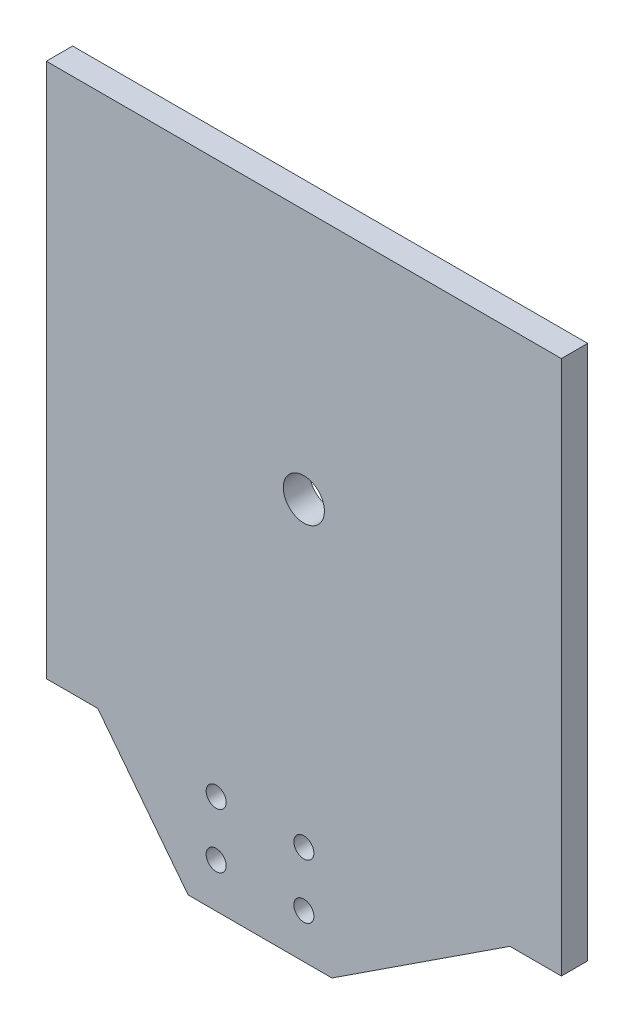
ISO-10303-21;
HEADER;
FILE_DESCRIPTION(('STEP AP214'),'2;1');
FILE_NAME('part.step','',(''),(''),'','','');
FILE_SCHEMA(('AUTOMOTIVE_DESIGN { 1 0 10303 214 1 1 1 1 }'));
ENDSEC;
DATA;
#1=APPLICATION_CONTEXT('core data for automotive mechanical design processes');
#2=APPLICATION_PROTOCOL_DEFINITION('international standard','automotive_design',2000,#1);
#3=PRODUCT_CONTEXT('',#1,'mechanical');
#4=PRODUCT('Part','Part','',(#3));
#5=PRODUCT_RELATED_PRODUCT_CATEGORY('part','',(#4));
#6=PRODUCT_DEFINITION_FORMATION('','',#4);
#7=PRODUCT_DEFINITION_CONTEXT('part definition',#1,'design');
#8=PRODUCT_DEFINITION('design','',#6,#7);
#9=PRODUCT_DEFINITION_SHAPE('','',#8);
#10=(LENGTH_UNIT() NAMED_UNIT(*) SI_UNIT(.MILLI.,.METRE.));
#11=(NAMED_UNIT(*) PLANE_ANGLE_UNIT() SI_UNIT($,.RADIAN.));
#12=(NAMED_UNIT(*) SI_UNIT($,.STERADIAN.) SOLID_ANGLE_UNIT());
#13=UNCERTAINTY_MEASURE_WITH_UNIT(LENGTH_MEASURE(1.E-05),#10,'distance_accuracy_value','');
#14=(GEOMETRIC_REPRESENTATION_CONTEXT(3) GLOBAL_UNCERTAINTY_ASSIGNED_CONTEXT((#13)) GLOBAL_UNIT_ASSIGNED_CONTEXT((#10,
#11,#12)) REPRESENTATION_CONTEXT('',''));
#15=CARTESIAN_POINT('',(0.,0.,0.));
#16=DIRECTION('',(0.,0.,1.));
#17=DIRECTION('',(1.,0.,0.));
#18=AXIS2_PLACEMENT_3D('',#15,#16,#17);
#19=CARTESIAN_POINT('',(0.,0.,6.096));
#20=DIRECTION('',(0.,0.,1.));
#21=DIRECTION('',(1.,0.,0.));
#22=AXIS2_PLACEMENT_3D('',#19,#20,#21);
#23=PLANE('',#22);
#24=CARTESIAN_POINT('',(59.69,-24.4475,6.096));
#25=DIRECTION('',(0.,0.,1.));
#26=DIRECTION('',(1.,0.,0.));
#27=AXIS2_PLACEMENT_3D('',#24,#25,#26);
#28=CIRCLE('',#27,2.3241);
#29=CARTESIAN_POINT('',(57.3659,-24.4475,6.096));
#30=VERTEX_POINT('',#29);
#31=EDGE_CURVE('E199',#30,#30,#28,.T.);
#32=ORIENTED_EDGE('',*,*,#31,.F.);
#33=EDGE_LOOP('',(#32));
#34=FACE_BOUND('',#33,.T.);
#35=CARTESIAN_POINT('',(39.37,-11.7475,6.096));
#36=DIRECTION('',(0.,0.,1.));
#37=DIRECTION('',(1.,0.,0.));
#38=AXIS2_PLACEMENT_3D('',#35,#36,#37);
#39=CIRCLE('',#38,2.3241);
#40=CARTESIAN_POINT('',(37.0459,-11.7475,6.096));
#41=VERTEX_POINT('',#40);
#42=EDGE_CURVE('E187',#41,#41,#39,.T.);
#43=ORIENTED_EDGE('',*,*,#42,.F.);
#44=EDGE_LOOP('',(#43));
#45=FACE_BOUND('',#44,.T.);
#46=DIRECTION('',(0.,-1.,0.));
#47=VECTOR('',#46,1.);
#48=CARTESIAN_POINT('',(0.,0.,6.096));
#49=LINE('',#48,#47);
#50=CARTESIAN_POINT('',(0.,116.205,6.096));
#51=VERTEX_POINT('',#50);
#52=CARTESIAN_POINT('',(0.,-7.747,6.096));
#53=VERTEX_POINT('',#52);
#54=EDGE_CURVE('E52',#51,#53,#49,.T.);
#55=ORIENTED_EDGE('',*,*,#54,.T.);
#56=DIRECTION('',(1.,0.,0.));
#57=VECTOR('',#56,1.);
#58=CARTESIAN_POINT('',(0.,-7.747,6.096));
#59=LINE('',#58,#57);
#60=CARTESIAN_POINT('',(11.938,-7.747,6.096));
#61=VERTEX_POINT('',#60);
#62=EDGE_CURVE('E95',#53,#61,#59,.T.);
#63=ORIENTED_EDGE('',*,*,#62,.T.);
#64=DIRECTION('',(0.612897000765742,-0.790162810091919,0.));
#65=VECTOR('',#64,1.);
#66=CARTESIAN_POINT('',(11.938,-7.747,6.096));
#67=LINE('',#66,#65);
#68=CARTESIAN_POINT('',(32.86125,-34.7218,6.096));
#69=VERTEX_POINT('',#68);
#70=EDGE_CURVE('E164',#61,#69,#67,.T.);
#71=ORIENTED_EDGE('',*,*,#70,.T.);
#72=DIRECTION('',(1.,0.,0.));
#73=VECTOR('',#72,1.);
#74=CARTESIAN_POINT('',(32.86125,-34.7218,6.096));
#75=LINE('',#74,#73);
#76=CARTESIAN_POINT('',(66.19875,-34.7218,6.096));
#77=VERTEX_POINT('',#76);
#78=EDGE_CURVE('E178',#69,#77,#75,.T.);
#79=ORIENTED_EDGE('',*,*,#78,.T.);
#80=DIRECTION('',(0.836894698303908,0.547363922770593,0.));
#81=VECTOR('',#80,1.);
#82=CARTESIAN_POINT('',(66.19875,-34.7218,6.096));
#83=LINE('',#82,#81);
#84=CARTESIAN_POINT('',(107.442,-7.74699999999998,6.096));
#85=VERTEX_POINT('',#84);
#86=EDGE_CURVE('E115',#77,#85,#83,.T.);
#87=ORIENTED_EDGE('',*,*,#86,.T.);
#88=DIRECTION('',(1.,0.,0.));
#89=VECTOR('',#88,1.);
#90=CARTESIAN_POINT('',(107.442,-7.74699999999998,6.096));
#91=LINE('',#90,#89);
#92=CARTESIAN_POINT('',(119.38,-7.74699999999998,6.096));
#93=VERTEX_POINT('',#92);
#94=EDGE_CURVE('E109',#85,#93,#91,.T.);
#95=ORIENTED_EDGE('',*,*,#94,.T.);
#96=DIRECTION('',(0.,1.,0.));
#97=VECTOR('',#96,1.);
#98=CARTESIAN_POINT('',(119.38,-7.74699999999998,6.096));
#99=LINE('',#98,#97);
#100=CARTESIAN_POINT('',(119.38,116.205,6.096));
#101=VERTEX_POINT('',#100);
#102=EDGE_CURVE('E113',#93,#101,#99,.T.);
#103=ORIENTED_EDGE('',*,*,#102,.T.);
#104=DIRECTION('',(-1.,0.,0.));
#105=VECTOR('',#104,1.);
#106=CARTESIAN_POINT('',(0.,116.205,6.096));
#107=LINE('',#106,#105);
#108=EDGE_CURVE('E130',#101,#51,#107,.T.);
#109=ORIENTED_EDGE('',*,*,#108,.T.);
#110=EDGE_LOOP('',(#55,#63,#71,#79,#87,#95,#103,#109));
#111=FACE_BOUND('',#110,.T.);
#112=CARTESIAN_POINT('',(59.69,58.1025,6.096));
#113=DIRECTION('',(0.,0.,1.));
#114=DIRECTION('',(1.,0.,0.));
#115=AXIS2_PLACEMENT_3D('',#112,#113,#114);
#116=CIRCLE('',#115,4.76249999999998);
#117=CARTESIAN_POINT('',(54.9275,58.1025,6.096));
#118=VERTEX_POINT('',#117);
#119=EDGE_CURVE('E139',#118,#118,#116,.T.);
#120=ORIENTED_EDGE('',*,*,#119,.F.);
#121=EDGE_LOOP('',(#120));
#122=FACE_BOUND('',#121,.T.);
#123=CARTESIAN_POINT('',(59.69,-11.7475,6.096));
#124=DIRECTION('',(0.,0.,1.));
#125=DIRECTION('',(1.,0.,0.));
#126=AXIS2_PLACEMENT_3D('',#123,#124,#125);
#127=CIRCLE('',#126,2.3241);
#128=CARTESIAN_POINT('',(57.3659,-11.7475,6.096));
#129=VERTEX_POINT('',#128);
#130=EDGE_CURVE('E193',#129,#129,#127,.T.);
#131=ORIENTED_EDGE('',*,*,#130,.F.);
#132=EDGE_LOOP('',(#131));
#133=FACE_BOUND('',#132,.T.);
#134=CARTESIAN_POINT('',(39.37,-24.4475,6.096));
#135=DIRECTION('',(0.,0.,1.));
#136=DIRECTION('',(1.,0.,0.));
#137=AXIS2_PLACEMENT_3D('',#134,#135,#136);
#138=CIRCLE('',#137,2.3241);
#139=CARTESIAN_POINT('',(37.0459,-24.4475,6.096));
#140=VERTEX_POINT('',#139);
#141=EDGE_CURVE('E205',#140,#140,#138,.T.);
#142=ORIENTED_EDGE('',*,*,#141,.F.);
#143=EDGE_LOOP('',(#142));
#144=FACE_BOUND('',#143,.T.);
#145=ADVANCED_FACE('F35',(#34,#45,#111,#122,#133,#144),#23,.T.);
#146=CARTESIAN_POINT('',(0.,0.,0.));
#147=DIRECTION('',(0.,0.,1.));
#148=DIRECTION('',(1.,0.,0.));
#149=AXIS2_PLACEMENT_3D('',#146,#147,#148);
#150=PLANE('',#149);
#151=CARTESIAN_POINT('',(59.69,-24.4475,0.));
#152=DIRECTION('',(0.,0.,1.));
#153=DIRECTION('',(1.,0.,0.));
#154=AXIS2_PLACEMENT_3D('',#151,#152,#153);
#155=CIRCLE('',#154,2.3241);
#156=CARTESIAN_POINT('',(57.3659,-24.4475,0.));
#157=VERTEX_POINT('',#156);
#158=EDGE_CURVE('E202',#157,#157,#155,.T.);
#159=ORIENTED_EDGE('',*,*,#158,.T.);
#160=EDGE_LOOP('',(#159));
#161=FACE_BOUND('',#160,.T.);
#162=CARTESIAN_POINT('',(39.37,-11.7475,0.));
#163=DIRECTION('',(0.,0.,1.));
#164=DIRECTION('',(1.,0.,0.));
#165=AXIS2_PLACEMENT_3D('',#162,#163,#164);
#166=CIRCLE('',#165,2.3241);
#167=CARTESIAN_POINT('',(37.0459,-11.7475,0.));
#168=VERTEX_POINT('',#167);
#169=EDGE_CURVE('E190',#168,#168,#166,.T.);
#170=ORIENTED_EDGE('',*,*,#169,.T.);
#171=EDGE_LOOP('',(#170));
#172=FACE_BOUND('',#171,.T.);
#173=DIRECTION('',(1.,0.,0.));
#174=VECTOR('',#173,1.);
#175=CARTESIAN_POINT('',(0.,-7.747,0.));
#176=LINE('',#175,#174);
#177=CARTESIAN_POINT('',(0.,-7.747,0.));
#178=VERTEX_POINT('',#177);
#179=CARTESIAN_POINT('',(11.938,-7.747,0.));
#180=VERTEX_POINT('',#179);
#181=EDGE_CURVE('E136',#178,#180,#176,.T.);
#182=ORIENTED_EDGE('',*,*,#181,.F.);
#183=DIRECTION('',(0.,-1.,0.));
#184=VECTOR('',#183,1.);
#185=CARTESIAN_POINT('',(0.,0.,0.));
#186=LINE('',#185,#184);
#187=CARTESIAN_POINT('',(0.,116.205,0.));
#188=VERTEX_POINT('',#187);
#189=EDGE_CURVE('E148',#188,#178,#186,.T.);
#190=ORIENTED_EDGE('',*,*,#189,.F.);
#191=DIRECTION('',(-1.,0.,0.));
#192=VECTOR('',#191,1.);
#193=CARTESIAN_POINT('',(0.,116.205,0.));
#194=LINE('',#193,#192);
#195=CARTESIAN_POINT('',(119.38,116.205,0.));
#196=VERTEX_POINT('',#195);
#197=EDGE_CURVE('E88',#196,#188,#194,.T.);
#198=ORIENTED_EDGE('',*,*,#197,.F.);
#199=DIRECTION('',(0.,1.,0.));
#200=VECTOR('',#199,1.);
#201=CARTESIAN_POINT('',(119.38,0.,0.));
#202=LINE('',#201,#200);
#203=CARTESIAN_POINT('',(119.38,-7.74699999999998,0.));
#204=VERTEX_POINT('',#203);
#205=EDGE_CURVE('E81',#204,#196,#202,.T.);
#206=ORIENTED_EDGE('',*,*,#205,.F.);
#207=DIRECTION('',(1.,0.,0.));
#208=VECTOR('',#207,1.);
#209=CARTESIAN_POINT('',(107.442,-7.74699999999998,0.));
#210=LINE('',#209,#208);
#211=CARTESIAN_POINT('',(107.442,-7.74699999999998,0.));
#212=VERTEX_POINT('',#211);
#213=EDGE_CURVE('E124',#212,#204,#210,.T.);
#214=ORIENTED_EDGE('',*,*,#213,.F.);
#215=DIRECTION('',(0.836894698303908,0.547363922770593,0.));
#216=VECTOR('',#215,1.);
#217=CARTESIAN_POINT('',(66.19875,-34.7218,0.));
#218=LINE('',#217,#216);
#219=CARTESIAN_POINT('',(66.19875,-34.7218,0.));
#220=VERTEX_POINT('',#219);
#221=EDGE_CURVE('E143',#220,#212,#218,.T.);
#222=ORIENTED_EDGE('',*,*,#221,.F.);
#223=DIRECTION('',(1.,0.,0.));
#224=VECTOR('',#223,1.);
#225=CARTESIAN_POINT('',(32.86125,-34.7218,0.));
#226=LINE('',#225,#224);
#227=CARTESIAN_POINT('',(32.86125,-34.7218,0.));
#228=VERTEX_POINT('',#227);
#229=EDGE_CURVE('E141',#228,#220,#226,.T.);
#230=ORIENTED_EDGE('',*,*,#229,.F.);
#231=DIRECTION('',(0.612897000765742,-0.790162810091919,0.));
#232=VECTOR('',#231,1.);
#233=CARTESIAN_POINT('',(11.938,-7.747,0.));
#234=LINE('',#233,#232);
#235=EDGE_CURVE('E138',#180,#228,#234,.T.);
#236=ORIENTED_EDGE('',*,*,#235,.F.);
#237=EDGE_LOOP('',(#182,#190,#198,#206,#214,#222,#230,#236));
#238=FACE_BOUND('',#237,.T.);
#239=CARTESIAN_POINT('',(59.69,58.1025,0.));
#240=DIRECTION('',(0.,0.,1.));
#241=DIRECTION('',(1.,0.,0.));
#242=AXIS2_PLACEMENT_3D('',#239,#240,#241);
#243=CIRCLE('',#242,4.76249999999998);
#244=CARTESIAN_POINT('',(54.9275,58.1025,0.));
#245=VERTEX_POINT('',#244);
#246=EDGE_CURVE('E184',#245,#245,#243,.T.);
#247=ORIENTED_EDGE('',*,*,#246,.T.);
#248=EDGE_LOOP('',(#247));
#249=FACE_BOUND('',#248,.T.);
#250=CARTESIAN_POINT('',(59.69,-11.7475,0.));
#251=DIRECTION('',(0.,0.,1.));
#252=DIRECTION('',(1.,0.,0.));
#253=AXIS2_PLACEMENT_3D('',#250,#251,#252);
#254=CIRCLE('',#253,2.3241);
#255=CARTESIAN_POINT('',(57.3659,-11.7475,0.));
#256=VERTEX_POINT('',#255);
#257=EDGE_CURVE('E196',#256,#256,#254,.T.);
#258=ORIENTED_EDGE('',*,*,#257,.T.);
#259=EDGE_LOOP('',(#258));
#260=FACE_BOUND('',#259,.T.);
#261=CARTESIAN_POINT('',(39.37,-24.4475,0.));
#262=DIRECTION('',(0.,0.,1.));
#263=DIRECTION('',(1.,0.,0.));
#264=AXIS2_PLACEMENT_3D('',#261,#262,#263);
#265=CIRCLE('',#264,2.3241);
#266=CARTESIAN_POINT('',(37.0459,-24.4475,0.));
#267=VERTEX_POINT('',#266);
#268=EDGE_CURVE('E208',#267,#267,#265,.T.);
#269=ORIENTED_EDGE('',*,*,#268,.T.);
#270=EDGE_LOOP('',(#269));
#271=FACE_BOUND('',#270,.T.);
#272=ADVANCED_FACE('F168',(#161,#172,#238,#249,#260,#271),#150,.F.);
#273=CARTESIAN_POINT('',(0.,-7.747,6.096));
#274=DIRECTION('',(0.,1.,0.));
#275=DIRECTION('',(0.,0.,1.));
#276=AXIS2_PLACEMENT_3D('',#273,#274,#275);
#277=PLANE('',#276);
#278=ORIENTED_EDGE('',*,*,#181,.T.);
#279=DIRECTION('',(0.,0.,-1.));
#280=VECTOR('',#279,1.);
#281=CARTESIAN_POINT('',(11.938,-7.747,6.096));
#282=LINE('',#281,#280);
#283=EDGE_CURVE('E44',#61,#180,#282,.T.);
#284=ORIENTED_EDGE('',*,*,#283,.F.);
#285=ORIENTED_EDGE('',*,*,#62,.F.);
#286=DIRECTION('',(0.,0.,-1.));
#287=VECTOR('',#286,1.);
#288=CARTESIAN_POINT('',(0.,-7.747,6.096));
#289=LINE('',#288,#287);
#290=EDGE_CURVE('E11',#53,#178,#289,.T.);
#291=ORIENTED_EDGE('',*,*,#290,.T.);
#292=EDGE_LOOP('',(#278,#284,#285,#291));
#293=FACE_BOUND('',#292,.T.);
#294=ADVANCED_FACE('F37',(#293),#277,.F.);
#295=CARTESIAN_POINT('',(11.938,-7.747,6.096));
#296=DIRECTION('',(0.790162810091919,0.612897000765742,0.));
#297=DIRECTION('',(-0.612897000765742,0.790162810091919,0.));
#298=AXIS2_PLACEMENT_3D('',#295,#296,#297);
#299=PLANE('',#298);
#300=ORIENTED_EDGE('',*,*,#235,.T.);
#301=DIRECTION('',(0.,0.,-1.));
#302=VECTOR('',#301,1.);
#303=CARTESIAN_POINT('',(32.86125,-34.7218,6.096));
#304=LINE('',#303,#302);
#305=EDGE_CURVE('E156',#69,#228,#304,.T.);
#306=ORIENTED_EDGE('',*,*,#305,.F.);
#307=ORIENTED_EDGE('',*,*,#70,.F.);
#308=ORIENTED_EDGE('',*,*,#283,.T.);
#309=EDGE_LOOP('',(#300,#306,#307,#308));
#310=FACE_BOUND('',#309,.T.);
#311=ADVANCED_FACE('F162',(#310),#299,.F.);
#312=CARTESIAN_POINT('',(32.86125,-34.7218,6.096));
#313=DIRECTION('',(0.,1.,0.));
#314=DIRECTION('',(-1.,0.,0.));
#315=AXIS2_PLACEMENT_3D('',#312,#313,#314);
#316=PLANE('',#315);
#317=ORIENTED_EDGE('',*,*,#229,.T.);
#318=DIRECTION('',(0.,0.,-1.));
#319=VECTOR('',#318,1.);
#320=CARTESIAN_POINT('',(66.19875,-34.7218,6.096));
#321=LINE('',#320,#319);
#322=EDGE_CURVE('E153',#77,#220,#321,.T.);
#323=ORIENTED_EDGE('',*,*,#322,.F.);
#324=ORIENTED_EDGE('',*,*,#78,.F.);
#325=ORIENTED_EDGE('',*,*,#305,.T.);
#326=EDGE_LOOP('',(#317,#323,#324,#325));
#327=FACE_BOUND('',#326,.T.);
#328=ADVANCED_FACE('F174',(#327),#316,.F.);
#329=CARTESIAN_POINT('',(66.19875,-34.7218,6.096));
#330=DIRECTION('',(-0.547363922770593,0.836894698303908,0.));
#331=DIRECTION('',(-0.836894698303908,-0.547363922770593,0.));
#332=AXIS2_PLACEMENT_3D('',#329,#330,#331);
#333=PLANE('',#332);
#334=ORIENTED_EDGE('',*,*,#221,.T.);
#335=DIRECTION('',(0.,0.,-1.));
#336=VECTOR('',#335,1.);
#337=CARTESIAN_POINT('',(107.442,-7.74699999999998,6.096));
#338=LINE('',#337,#336);
#339=EDGE_CURVE('E125',#85,#212,#338,.T.);
#340=ORIENTED_EDGE('',*,*,#339,.F.);
#341=ORIENTED_EDGE('',*,*,#86,.F.);
#342=ORIENTED_EDGE('',*,*,#322,.T.);
#343=EDGE_LOOP('',(#334,#340,#341,#342));
#344=FACE_BOUND('',#343,.T.);
#345=ADVANCED_FACE('F177',(#344),#333,.F.);
#346=CARTESIAN_POINT('',(107.442,-7.74699999999998,6.096));
#347=DIRECTION('',(0.,1.,0.));
#348=DIRECTION('',(-1.,0.,0.));
#349=AXIS2_PLACEMENT_3D('',#346,#347,#348);
#350=PLANE('',#349);
#351=ORIENTED_EDGE('',*,*,#213,.T.);
#352=DIRECTION('',(0.,0.,-1.));
#353=VECTOR('',#352,1.);
#354=CARTESIAN_POINT('',(119.38,-7.74699999999998,6.096));
#355=LINE('',#354,#353);
#356=EDGE_CURVE('E121',#93,#204,#355,.T.);
#357=ORIENTED_EDGE('',*,*,#356,.F.);
#358=ORIENTED_EDGE('',*,*,#94,.F.);
#359=ORIENTED_EDGE('',*,*,#339,.T.);
#360=EDGE_LOOP('',(#351,#357,#358,#359));
#361=FACE_BOUND('',#360,.T.);
#362=ADVANCED_FACE('F122',(#361),#350,.F.);
#363=CARTESIAN_POINT('',(119.38,0.,6.096));
#364=DIRECTION('',(-1.,0.,0.));
#365=DIRECTION('',(0.,0.,1.));
#366=AXIS2_PLACEMENT_3D('',#363,#364,#365);
#367=PLANE('',#366);
#368=ORIENTED_EDGE('',*,*,#205,.T.);
#369=DIRECTION('',(0.,0.,-1.));
#370=VECTOR('',#369,1.);
#371=CARTESIAN_POINT('',(119.38,116.205,6.096));
#372=LINE('',#371,#370);
#373=EDGE_CURVE('E126',#101,#196,#372,.T.);
#374=ORIENTED_EDGE('',*,*,#373,.F.);
#375=ORIENTED_EDGE('',*,*,#102,.F.);
#376=ORIENTED_EDGE('',*,*,#356,.T.);
#377=EDGE_LOOP('',(#368,#374,#375,#376));
#378=FACE_BOUND('',#377,.T.);
#379=ADVANCED_FACE('F128',(#378),#367,.F.);
#380=CARTESIAN_POINT('',(0.,116.205,6.096));
#381=DIRECTION('',(0.,-1.,0.));
#382=DIRECTION('',(1.,0.,0.));
#383=AXIS2_PLACEMENT_3D('',#380,#381,#382);
#384=PLANE('',#383);
#385=ORIENTED_EDGE('',*,*,#197,.T.);
#386=DIRECTION('',(0.,0.,-1.));
#387=VECTOR('',#386,1.);
#388=CARTESIAN_POINT('',(0.,116.205,6.096));
#389=LINE('',#388,#387);
#390=EDGE_CURVE('E132',#51,#188,#389,.T.);
#391=ORIENTED_EDGE('',*,*,#390,.F.);
#392=ORIENTED_EDGE('',*,*,#108,.F.);
#393=ORIENTED_EDGE('',*,*,#373,.T.);
#394=EDGE_LOOP('',(#385,#391,#392,#393));
#395=FACE_BOUND('',#394,.T.);
#396=ADVANCED_FACE('F234',(#395),#384,.F.);
#397=CARTESIAN_POINT('',(0.,0.,6.096));
#398=DIRECTION('',(1.,0.,0.));
#399=DIRECTION('',(0.,1.,0.));
#400=AXIS2_PLACEMENT_3D('',#397,#398,#399);
#401=PLANE('',#400);
#402=ORIENTED_EDGE('',*,*,#189,.T.);
#403=ORIENTED_EDGE('',*,*,#290,.F.);
#404=ORIENTED_EDGE('',*,*,#54,.F.);
#405=ORIENTED_EDGE('',*,*,#390,.T.);
#406=EDGE_LOOP('',(#402,#403,#404,#405));
#407=FACE_BOUND('',#406,.T.);
#408=ADVANCED_FACE('F231',(#407),#401,.F.);
#409=CARTESIAN_POINT('',(59.69,58.1025,6.096));
#410=DIRECTION('',(0.,0.,-1.));
#411=DIRECTION('',(-1.,0.,0.));
#412=AXIS2_PLACEMENT_3D('',#409,#410,#411);
#413=CYLINDRICAL_SURFACE('',#412,4.76249999999998);
#414=CARTESIAN_POINT('',(54.9275,58.1025,6.096));
#415=CARTESIAN_POINT('',(54.9275,58.1025,6.0325));
#416=CARTESIAN_POINT('',(54.9275,58.1025,5.969));
#417=CARTESIAN_POINT('',(54.9275,58.1025,5.842));
#418=CARTESIAN_POINT('',(54.9275,58.1025,5.7785));
#419=CARTESIAN_POINT('',(54.9275,58.1025,5.6515));
#420=CARTESIAN_POINT('',(54.9275,58.1025,5.588));
#421=CARTESIAN_POINT('',(54.9275,58.1025,5.461));
#422=CARTESIAN_POINT('',(54.9275,58.1025,5.3975));
#423=CARTESIAN_POINT('',(54.9275,58.1025,5.2705));
#424=CARTESIAN_POINT('',(54.9275,58.1025,5.207));
#425=CARTESIAN_POINT('',(54.9275,58.1025,5.08));
#426=CARTESIAN_POINT('',(54.9275,58.1025,5.0165));
#427=CARTESIAN_POINT('',(54.9275,58.1025,4.8895));
#428=CARTESIAN_POINT('',(54.9275,58.1025,4.826));
#429=CARTESIAN_POINT('',(54.9275,58.1025,4.699));
#430=CARTESIAN_POINT('',(54.9275,58.1025,4.6355));
#431=CARTESIAN_POINT('',(54.9275,58.1025,4.5085));
#432=CARTESIAN_POINT('',(54.9275,58.1025,4.445));
#433=CARTESIAN_POINT('',(54.9275,58.1025,4.318));
#434=CARTESIAN_POINT('',(54.9275,58.1025,4.2545));
#435=CARTESIAN_POINT('',(54.9275,58.1025,4.1275));
#436=CARTESIAN_POINT('',(54.9275,58.1025,4.064));
#437=CARTESIAN_POINT('',(54.9275,58.1025,3.937));
#438=CARTESIAN_POINT('',(54.9275,58.1025,3.8735));
#439=CARTESIAN_POINT('',(54.9275,58.1025,3.7465));
#440=CARTESIAN_POINT('',(54.9275,58.1025,3.683));
#441=CARTESIAN_POINT('',(54.9275,58.1025,3.556));
#442=CARTESIAN_POINT('',(54.9275,58.1025,3.4925));
#443=CARTESIAN_POINT('',(54.9275,58.1025,3.3655));
#444=CARTESIAN_POINT('',(54.9275,58.1025,3.302));
#445=CARTESIAN_POINT('',(54.9275,58.1025,3.175));
#446=CARTESIAN_POINT('',(54.9275,58.1025,3.1115));
#447=CARTESIAN_POINT('',(54.9275,58.1025,2.9845));
#448=CARTESIAN_POINT('',(54.9275,58.1025,2.921));
#449=CARTESIAN_POINT('',(54.9275,58.1025,2.794));
#450=CARTESIAN_POINT('',(54.9275,58.1025,2.7305));
#451=CARTESIAN_POINT('',(54.9275,58.1025,2.6035));
#452=CARTESIAN_POINT('',(54.9275,58.1025,2.54));
#453=CARTESIAN_POINT('',(54.9275,58.1025,2.413));
#454=CARTESIAN_POINT('',(54.9275,58.1025,2.3495));
#455=CARTESIAN_POINT('',(54.9275,58.1025,2.2225));
#456=CARTESIAN_POINT('',(54.9275,58.1025,2.159));
#457=CARTESIAN_POINT('',(54.9275,58.1025,2.032));
#458=CARTESIAN_POINT('',(54.9275,58.1025,1.9685));
#459=CARTESIAN_POINT('',(54.9275,58.1025,1.8415));
#460=CARTESIAN_POINT('',(54.9275,58.1025,1.778));
#461=CARTESIAN_POINT('',(54.9275,58.1025,1.651));
#462=CARTESIAN_POINT('',(54.9275,58.1025,1.5875));
#463=CARTESIAN_POINT('',(54.9275,58.1025,1.4605));
#464=CARTESIAN_POINT('',(54.9275,58.1025,1.397));
#465=CARTESIAN_POINT('',(54.9275,58.1025,1.27));
#466=CARTESIAN_POINT('',(54.9275,58.1025,1.2065));
#467=CARTESIAN_POINT('',(54.9275,58.1025,1.0795));
#468=CARTESIAN_POINT('',(54.9275,58.1025,1.016));
#469=CARTESIAN_POINT('',(54.9275,58.1025,0.889));
#470=CARTESIAN_POINT('',(54.9275,58.1025,0.8255));
#471=CARTESIAN_POINT('',(54.9275,58.1025,0.6985));
#472=CARTESIAN_POINT('',(54.9275,58.1025,0.635));
#473=CARTESIAN_POINT('',(54.9275,58.1025,0.508));
#474=CARTESIAN_POINT('',(54.9275,58.1025,0.4445));
#475=CARTESIAN_POINT('',(54.9275,58.1025,0.3175));
#476=CARTESIAN_POINT('',(54.9275,58.1025,0.254));
#477=CARTESIAN_POINT('',(54.9275,58.1025,0.127));
#478=CARTESIAN_POINT('',(54.9275,58.1025,0.0634999999999999));
#479=CARTESIAN_POINT('',(54.9275,58.1025,0.));
#480=B_SPLINE_CURVE_WITH_KNOTS('',3,(#414,#415,#416,#417,#418,#419,#420,#421,#422,#423,#424,
#425,#426,#427,#428,#429,#430,#431,#432,#433,#434,#435,#436,#437,#438,#439,#440,#441,#442,#443,
#444,#445,#446,#447,#448,#449,#450,#451,#452,#453,#454,#455,#456,#457,#458,#459,#460,#461,#462,
#463,#464,#465,#466,#467,#468,#469,#470,#471,#472,#473,#474,#475,#476,#477,#478,#479),
.UNSPECIFIED.,.F.,.F.,(4,2,2,2,2,2,2,2,2,2,2,2,2,2,2,2,2,2,2,2,2,2,2,2,2,2,2,2,2,2,2,2,4),(0.,
0.190500000000001,0.381,0.5715,0.762000000000001,0.9525,1.143,1.3335,1.524,1.7145,1.905,2.0955,
2.286,2.4765,2.667,2.8575,3.048,3.2385,3.429,3.6195,3.81,4.0005,4.191,4.3815,4.572,4.7625,4.953,
5.1435,5.334,5.5245,5.715,5.9055,6.096),.UNSPECIFIED.);
#481=EDGE_CURVE('BSEAM228',#118,#245,#480,.T.);
#482=ORIENTED_EDGE('',*,*,#119,.T.);
#483=ORIENTED_EDGE('',*,*,#246,.F.);
#484=ORIENTED_EDGE('',*,*,#481,.T.);
#485=ORIENTED_EDGE('',*,*,#481,.F.);
#486=EDGE_LOOP('',(#482,#484,#483,#485));
#487=FACE_BOUND('',#486,.T.);
#488=ADVANCED_FACE('F228',(#487),#413,.F.);
#489=CARTESIAN_POINT('',(39.37,-11.7475,6.096));
#490=DIRECTION('',(0.,0.,-1.));
#491=DIRECTION('',(-1.,0.,0.));
#492=AXIS2_PLACEMENT_3D('',#489,#490,#491);
#493=CYLINDRICAL_SURFACE('',#492,2.3241);
#494=CARTESIAN_POINT('',(37.0459,-11.7475,6.096));
#495=CARTESIAN_POINT('',(37.0459,-11.7475,6.0325));
#496=CARTESIAN_POINT('',(37.0459,-11.7475,5.969));
#497=CARTESIAN_POINT('',(37.0459,-11.7475,5.842));
#498=CARTESIAN_POINT('',(37.0459,-11.7475,5.7785));
#499=CARTESIAN_POINT('',(37.0459,-11.7475,5.6515));
#500=CARTESIAN_POINT('',(37.0459,-11.7475,5.588));
#501=CARTESIAN_POINT('',(37.0459,-11.7475,5.461));
#502=CARTESIAN_POINT('',(37.0459,-11.7475,5.3975));
#503=CARTESIAN_POINT('',(37.0459,-11.7475,5.2705));
#504=CARTESIAN_POINT('',(37.0459,-11.7475,5.207));
#505=CARTESIAN_POINT('',(37.0459,-11.7475,5.08));
#506=CARTESIAN_POINT('',(37.0459,-11.7475,5.0165));
#507=CARTESIAN_POINT('',(37.0459,-11.7475,4.8895));
#508=CARTESIAN_POINT('',(37.0459,-11.7475,4.826));
#509=CARTESIAN_POINT('',(37.0459,-11.7475,4.699));
#510=CARTESIAN_POINT('',(37.0459,-11.7475,4.6355));
#511=CARTESIAN_POINT('',(37.0459,-11.7475,4.5085));
#512=CARTESIAN_POINT('',(37.0459,-11.7475,4.445));
#513=CARTESIAN_POINT('',(37.0459,-11.7475,4.318));
#514=CARTESIAN_POINT('',(37.0459,-11.7475,4.2545));
#515=CARTESIAN_POINT('',(37.0459,-11.7475,4.1275));
#516=CARTESIAN_POINT('',(37.0459,-11.7475,4.064));
#517=CARTESIAN_POINT('',(37.0459,-11.7475,3.937));
#518=CARTESIAN_POINT('',(37.0459,-11.7475,3.8735));
#519=CARTESIAN_POINT('',(37.0459,-11.7475,3.7465));
#520=CARTESIAN_POINT('',(37.0459,-11.7475,3.683));
#521=CARTESIAN_POINT('',(37.0459,-11.7475,3.556));
#522=CARTESIAN_POINT('',(37.0459,-11.7475,3.4925));
#523=CARTESIAN_POINT('',(37.0459,-11.7475,3.3655));
#524=CARTESIAN_POINT('',(37.0459,-11.7475,3.302));
#525=CARTESIAN_POINT('',(37.0459,-11.7475,3.175));
#526=CARTESIAN_POINT('',(37.0459,-11.7475,3.1115));
#527=CARTESIAN_POINT('',(37.0459,-11.7475,2.9845));
#528=CARTESIAN_POINT('',(37.0459,-11.7475,2.921));
#529=CARTESIAN_POINT('',(37.0459,-11.7475,2.794));
#530=CARTESIAN_POINT('',(37.0459,-11.7475,2.7305));
#531=CARTESIAN_POINT('',(37.0459,-11.7475,2.6035));
#532=CARTESIAN_POINT('',(37.0459,-11.7475,2.54));
#533=CARTESIAN_POINT('',(37.0459,-11.7475,2.413));
#534=CARTESIAN_POINT('',(37.0459,-11.7475,2.3495));
#535=CARTESIAN_POINT('',(37.0459,-11.7475,2.2225));
#536=CARTESIAN_POINT('',(37.0459,-11.7475,2.159));
#537=CARTESIAN_POINT('',(37.0459,-11.7475,2.032));
#538=CARTESIAN_POINT('',(37.0459,-11.7475,1.9685));
#539=CARTESIAN_POINT('',(37.0459,-11.7475,1.8415));
#540=CARTESIAN_POINT('',(37.0459,-11.7475,1.778));
#541=CARTESIAN_POINT('',(37.0459,-11.7475,1.651));
#542=CARTESIAN_POINT('',(37.0459,-11.7475,1.5875));
#543=CARTESIAN_POINT('',(37.0459,-11.7475,1.4605));
#544=CARTESIAN_POINT('',(37.0459,-11.7475,1.397));
#545=CARTESIAN_POINT('',(37.0459,-11.7475,1.27));
#546=CARTESIAN_POINT('',(37.0459,-11.7475,1.2065));
#547=CARTESIAN_POINT('',(37.0459,-11.7475,1.0795));
#548=CARTESIAN_POINT('',(37.0459,-11.7475,1.016));
#549=CARTESIAN_POINT('',(37.0459,-11.7475,0.889));
#550=CARTESIAN_POINT('',(37.0459,-11.7475,0.8255));
#551=CARTESIAN_POINT('',(37.0459,-11.7475,0.6985));
#552=CARTESIAN_POINT('',(37.0459,-11.7475,0.635));
#553=CARTESIAN_POINT('',(37.0459,-11.7475,0.508));
#554=CARTESIAN_POINT('',(37.0459,-11.7475,0.4445));
#555=CARTESIAN_POINT('',(37.0459,-11.7475,0.3175));
#556=CARTESIAN_POINT('',(37.0459,-11.7475,0.254));
#557=CARTESIAN_POINT('',(37.0459,-11.7475,0.127));
#558=CARTESIAN_POINT('',(37.0459,-11.7475,0.0634999999999999));
#559=CARTESIAN_POINT('',(37.0459,-11.7475,0.));
#560=B_SPLINE_CURVE_WITH_KNOTS('',3,(#494,#495,#496,#497,#498,#499,#500,#501,#502,#503,#504,
#505,#506,#507,#508,#509,#510,#511,#512,#513,#514,#515,#516,#517,#518,#519,#520,#521,#522,#523,
#524,#525,#526,#527,#528,#529,#530,#531,#532,#533,#534,#535,#536,#537,#538,#539,#540,#541,#542,
#543,#544,#545,#546,#547,#548,#549,#550,#551,#552,#553,#554,#555,#556,#557,#558,#559),
.UNSPECIFIED.,.F.,.F.,(4,2,2,2,2,2,2,2,2,2,2,2,2,2,2,2,2,2,2,2,2,2,2,2,2,2,2,2,2,2,2,2,4),(0.,
0.190500000000001,0.381,0.5715,0.762000000000001,0.9525,1.143,1.3335,1.524,1.7145,1.905,2.0955,
2.286,2.4765,2.667,2.8575,3.048,3.2385,3.429,3.6195,3.81,4.0005,4.191,4.3815,4.572,4.7625,4.953,
5.1435,5.334,5.5245,5.715,5.9055,6.096),.UNSPECIFIED.);
#561=EDGE_CURVE('BSEAM310',#41,#168,#560,.T.);
#562=ORIENTED_EDGE('',*,*,#42,.T.);
#563=ORIENTED_EDGE('',*,*,#169,.F.);
#564=ORIENTED_EDGE('',*,*,#561,.T.);
#565=ORIENTED_EDGE('',*,*,#561,.F.);
#566=EDGE_LOOP('',(#562,#564,#563,#565));
#567=FACE_BOUND('',#566,.T.);
#568=ADVANCED_FACE('F310',(#567),#493,.F.);
#569=CARTESIAN_POINT('',(59.69,-11.7475,6.096));
#570=DIRECTION('',(0.,0.,-1.));
#571=DIRECTION('',(-1.,0.,0.));
#572=AXIS2_PLACEMENT_3D('',#569,#570,#571);
#573=CYLINDRICAL_SURFACE('',#572,2.3241);
#574=CARTESIAN_POINT('',(57.3659,-11.7475,6.096));
#575=CARTESIAN_POINT('',(57.3659,-11.7475,6.0325));
#576=CARTESIAN_POINT('',(57.3659,-11.7475,5.969));
#577=CARTESIAN_POINT('',(57.3659,-11.7475,5.842));
#578=CARTESIAN_POINT('',(57.3659,-11.7475,5.7785));
#579=CARTESIAN_POINT('',(57.3659,-11.7475,5.6515));
#580=CARTESIAN_POINT('',(57.3659,-11.7475,5.588));
#581=CARTESIAN_POINT('',(57.3659,-11.7475,5.461));
#582=CARTESIAN_POINT('',(57.3659,-11.7475,5.3975));
#583=CARTESIAN_POINT('',(57.3659,-11.7475,5.2705));
#584=CARTESIAN_POINT('',(57.3659,-11.7475,5.207));
#585=CARTESIAN_POINT('',(57.3659,-11.7475,5.08));
#586=CARTESIAN_POINT('',(57.3659,-11.7475,5.0165));
#587=CARTESIAN_POINT('',(57.3659,-11.7475,4.8895));
#588=CARTESIAN_POINT('',(57.3659,-11.7475,4.826));
#589=CARTESIAN_POINT('',(57.3659,-11.7475,4.699));
#590=CARTESIAN_POINT('',(57.3659,-11.7475,4.6355));
#591=CARTESIAN_POINT('',(57.3659,-11.7475,4.5085));
#592=CARTESIAN_POINT('',(57.3659,-11.7475,4.445));
#593=CARTESIAN_POINT('',(57.3659,-11.7475,4.318));
#594=CARTESIAN_POINT('',(57.3659,-11.7475,4.2545));
#595=CARTESIAN_POINT('',(57.3659,-11.7475,4.1275));
#596=CARTESIAN_POINT('',(57.3659,-11.7475,4.064));
#597=CARTESIAN_POINT('',(57.3659,-11.7475,3.937));
#598=CARTESIAN_POINT('',(57.3659,-11.7475,3.8735));
#599=CARTESIAN_POINT('',(57.3659,-11.7475,3.7465));
#600=CARTESIAN_POINT('',(57.3659,-11.7475,3.683));
#601=CARTESIAN_POINT('',(57.3659,-11.7475,3.556));
#602=CARTESIAN_POINT('',(57.3659,-11.7475,3.4925));
#603=CARTESIAN_POINT('',(57.3659,-11.7475,3.3655));
#604=CARTESIAN_POINT('',(57.3659,-11.7475,3.302));
#605=CARTESIAN_POINT('',(57.3659,-11.7475,3.175));
#606=CARTESIAN_POINT('',(57.3659,-11.7475,3.1115));
#607=CARTESIAN_POINT('',(57.3659,-11.7475,2.9845));
#608=CARTESIAN_POINT('',(57.3659,-11.7475,2.921));
#609=CARTESIAN_POINT('',(57.3659,-11.7475,2.794));
#610=CARTESIAN_POINT('',(57.3659,-11.7475,2.7305));
#611=CARTESIAN_POINT('',(57.3659,-11.7475,2.6035));
#612=CARTESIAN_POINT('',(57.3659,-11.7475,2.54));
#613=CARTESIAN_POINT('',(57.3659,-11.7475,2.413));
#614=CARTESIAN_POINT('',(57.3659,-11.7475,2.3495));
#615=CARTESIAN_POINT('',(57.3659,-11.7475,2.2225));
#616=CARTESIAN_POINT('',(57.3659,-11.7475,2.159));
#617=CARTESIAN_POINT('',(57.3659,-11.7475,2.032));
#618=CARTESIAN_POINT('',(57.3659,-11.7475,1.9685));
#619=CARTESIAN_POINT('',(57.3659,-11.7475,1.8415));
#620=CARTESIAN_POINT('',(57.3659,-11.7475,1.778));
#621=CARTESIAN_POINT('',(57.3659,-11.7475,1.651));
#622=CARTESIAN_POINT('',(57.3659,-11.7475,1.5875));
#623=CARTESIAN_POINT('',(57.3659,-11.7475,1.4605));
#624=CARTESIAN_POINT('',(57.3659,-11.7475,1.397));
#625=CARTESIAN_POINT('',(57.3659,-11.7475,1.27));
#626=CARTESIAN_POINT('',(57.3659,-11.7475,1.2065));
#627=CARTESIAN_POINT('',(57.3659,-11.7475,1.0795));
#628=CARTESIAN_POINT('',(57.3659,-11.7475,1.016));
#629=CARTESIAN_POINT('',(57.3659,-11.7475,0.889));
#630=CARTESIAN_POINT('',(57.3659,-11.7475,0.8255));
#631=CARTESIAN_POINT('',(57.3659,-11.7475,0.6985));
#632=CARTESIAN_POINT('',(57.3659,-11.7475,0.635));
#633=CARTESIAN_POINT('',(57.3659,-11.7475,0.508));
#634=CARTESIAN_POINT('',(57.3659,-11.7475,0.4445));
#635=CARTESIAN_POINT('',(57.3659,-11.7475,0.3175));
#636=CARTESIAN_POINT('',(57.3659,-11.7475,0.254));
#637=CARTESIAN_POINT('',(57.3659,-11.7475,0.127));
#638=CARTESIAN_POINT('',(57.3659,-11.7475,0.0634999999999999));
#639=CARTESIAN_POINT('',(57.3659,-11.7475,0.));
#640=B_SPLINE_CURVE_WITH_KNOTS('',3,(#574,#575,#576,#577,#578,#579,#580,#581,#582,#583,#584,
#585,#586,#587,#588,#589,#590,#591,#592,#593,#594,#595,#596,#597,#598,#599,#600,#601,#602,#603,
#604,#605,#606,#607,#608,#609,#610,#611,#612,#613,#614,#615,#616,#617,#618,#619,#620,#621,#622,
#623,#624,#625,#626,#627,#628,#629,#630,#631,#632,#633,#634,#635,#636,#637,#638,#639),
.UNSPECIFIED.,.F.,.F.,(4,2,2,2,2,2,2,2,2,2,2,2,2,2,2,2,2,2,2,2,2,2,2,2,2,2,2,2,2,2,2,2,4),(0.,
0.190500000000001,0.381,0.5715,0.762000000000001,0.9525,1.143,1.3335,1.524,1.7145,1.905,2.0955,
2.286,2.4765,2.667,2.8575,3.048,3.2385,3.429,3.6195,3.81,4.0005,4.191,4.3815,4.572,4.7625,4.953,
5.1435,5.334,5.5245,5.715,5.9055,6.096),.UNSPECIFIED.);
#641=EDGE_CURVE('BSEAM318',#129,#256,#640,.T.);
#642=ORIENTED_EDGE('',*,*,#130,.T.);
#643=ORIENTED_EDGE('',*,*,#257,.F.);
#644=ORIENTED_EDGE('',*,*,#641,.T.);
#645=ORIENTED_EDGE('',*,*,#641,.F.);
#646=EDGE_LOOP('',(#642,#644,#643,#645));
#647=FACE_BOUND('',#646,.T.);
#648=ADVANCED_FACE('F318',(#647),#573,.F.);
#649=CARTESIAN_POINT('',(59.69,-24.4475,6.096));
#650=DIRECTION('',(0.,0.,-1.));
#651=DIRECTION('',(-1.,0.,0.));
#652=AXIS2_PLACEMENT_3D('',#649,#650,#651);
#653=CYLINDRICAL_SURFACE('',#652,2.3241);
#654=CARTESIAN_POINT('',(57.3659,-24.4475,6.096));
#655=CARTESIAN_POINT('',(57.3659,-24.4475,6.0325));
#656=CARTESIAN_POINT('',(57.3659,-24.4475,5.969));
#657=CARTESIAN_POINT('',(57.3659,-24.4475,5.842));
#658=CARTESIAN_POINT('',(57.3659,-24.4475,5.7785));
#659=CARTESIAN_POINT('',(57.3659,-24.4475,5.6515));
#660=CARTESIAN_POINT('',(57.3659,-24.4475,5.588));
#661=CARTESIAN_POINT('',(57.3659,-24.4475,5.461));
#662=CARTESIAN_POINT('',(57.3659,-24.4475,5.3975));
#663=CARTESIAN_POINT('',(57.3659,-24.4475,5.2705));
#664=CARTESIAN_POINT('',(57.3659,-24.4475,5.207));
#665=CARTESIAN_POINT('',(57.3659,-24.4475,5.08));
#666=CARTESIAN_POINT('',(57.3659,-24.4475,5.0165));
#667=CARTESIAN_POINT('',(57.3659,-24.4475,4.8895));
#668=CARTESIAN_POINT('',(57.3659,-24.4475,4.826));
#669=CARTESIAN_POINT('',(57.3659,-24.4475,4.699));
#670=CARTESIAN_POINT('',(57.3659,-24.4475,4.6355));
#671=CARTESIAN_POINT('',(57.3659,-24.4475,4.5085));
#672=CARTESIAN_POINT('',(57.3659,-24.4475,4.445));
#673=CARTESIAN_POINT('',(57.3659,-24.4475,4.318));
#674=CARTESIAN_POINT('',(57.3659,-24.4475,4.2545));
#675=CARTESIAN_POINT('',(57.3659,-24.4475,4.1275));
#676=CARTESIAN_POINT('',(57.3659,-24.4475,4.064));
#677=CARTESIAN_POINT('',(57.3659,-24.4475,3.937));
#678=CARTESIAN_POINT('',(57.3659,-24.4475,3.8735));
#679=CARTESIAN_POINT('',(57.3659,-24.4475,3.7465));
#680=CARTESIAN_POINT('',(57.3659,-24.4475,3.683));
#681=CARTESIAN_POINT('',(57.3659,-24.4475,3.556));
#682=CARTESIAN_POINT('',(57.3659,-24.4475,3.4925));
#683=CARTESIAN_POINT('',(57.3659,-24.4475,3.3655));
#684=CARTESIAN_POINT('',(57.3659,-24.4475,3.302));
#685=CARTESIAN_POINT('',(57.3659,-24.4475,3.175));
#686=CARTESIAN_POINT('',(57.3659,-24.4475,3.1115));
#687=CARTESIAN_POINT('',(57.3659,-24.4475,2.9845));
#688=CARTESIAN_POINT('',(57.3659,-24.4475,2.921));
#689=CARTESIAN_POINT('',(57.3659,-24.4475,2.794));
#690=CARTESIAN_POINT('',(57.3659,-24.4475,2.7305));
#691=CARTESIAN_POINT('',(57.3659,-24.4475,2.6035));
#692=CARTESIAN_POINT('',(57.3659,-24.4475,2.54));
#693=CARTESIAN_POINT('',(57.3659,-24.4475,2.413));
#694=CARTESIAN_POINT('',(57.3659,-24.4475,2.3495));
#695=CARTESIAN_POINT('',(57.3659,-24.4475,2.2225));
#696=CARTESIAN_POINT('',(57.3659,-24.4475,2.159));
#697=CARTESIAN_POINT('',(57.3659,-24.4475,2.032));
#698=CARTESIAN_POINT('',(57.3659,-24.4475,1.9685));
#699=CARTESIAN_POINT('',(57.3659,-24.4475,1.8415));
#700=CARTESIAN_POINT('',(57.3659,-24.4475,1.778));
#701=CARTESIAN_POINT('',(57.3659,-24.4475,1.651));
#702=CARTESIAN_POINT('',(57.3659,-24.4475,1.5875));
#703=CARTESIAN_POINT('',(57.3659,-24.4475,1.4605));
#704=CARTESIAN_POINT('',(57.3659,-24.4475,1.397));
#705=CARTESIAN_POINT('',(57.3659,-24.4475,1.27));
#706=CARTESIAN_POINT('',(57.3659,-24.4475,1.2065));
#707=CARTESIAN_POINT('',(57.3659,-24.4475,1.0795));
#708=CARTESIAN_POINT('',(57.3659,-24.4475,1.016));
#709=CARTESIAN_POINT('',(57.3659,-24.4475,0.889));
#710=CARTESIAN_POINT('',(57.3659,-24.4475,0.8255));
#711=CARTESIAN_POINT('',(57.3659,-24.4475,0.6985));
#712=CARTESIAN_POINT('',(57.3659,-24.4475,0.635));
#713=CARTESIAN_POINT('',(57.3659,-24.4475,0.508));
#714=CARTESIAN_POINT('',(57.3659,-24.4475,0.4445));
#715=CARTESIAN_POINT('',(57.3659,-24.4475,0.3175));
#716=CARTESIAN_POINT('',(57.3659,-24.4475,0.254));
#717=CARTESIAN_POINT('',(57.3659,-24.4475,0.127));
#718=CARTESIAN_POINT('',(57.3659,-24.4475,0.0634999999999999));
#719=CARTESIAN_POINT('',(57.3659,-24.4475,0.));
#720=B_SPLINE_CURVE_WITH_KNOTS('',3,(#654,#655,#656,#657,#658,#659,#660,#661,#662,#663,#664,
#665,#666,#667,#668,#669,#670,#671,#672,#673,#674,#675,#676,#677,#678,#679,#680,#681,#682,#683,
#684,#685,#686,#687,#688,#689,#690,#691,#692,#693,#694,#695,#696,#697,#698,#699,#700,#701,#702,
#703,#704,#705,#706,#707,#708,#709,#710,#711,#712,#713,#714,#715,#716,#717,#718,#719),
.UNSPECIFIED.,.F.,.F.,(4,2,2,2,2,2,2,2,2,2,2,2,2,2,2,2,2,2,2,2,2,2,2,2,2,2,2,2,2,2,2,2,4),(0.,
0.190500000000001,0.381,0.5715,0.762000000000001,0.9525,1.143,1.3335,1.524,1.7145,1.905,2.0955,
2.286,2.4765,2.667,2.8575,3.048,3.2385,3.429,3.6195,3.81,4.0005,4.191,4.3815,4.572,4.7625,4.953,
5.1435,5.334,5.5245,5.715,5.9055,6.096),.UNSPECIFIED.);
#721=EDGE_CURVE('BSEAM326',#30,#157,#720,.T.);
#722=ORIENTED_EDGE('',*,*,#31,.T.);
#723=ORIENTED_EDGE('',*,*,#158,.F.);
#724=ORIENTED_EDGE('',*,*,#721,.T.);
#725=ORIENTED_EDGE('',*,*,#721,.F.);
#726=EDGE_LOOP('',(#722,#724,#723,#725));
#727=FACE_BOUND('',#726,.T.);
#728=ADVANCED_FACE('F326',(#727),#653,.F.);
#729=CARTESIAN_POINT('',(39.37,-24.4475,6.096));
#730=DIRECTION('',(0.,0.,-1.));
#731=DIRECTION('',(-1.,0.,0.));
#732=AXIS2_PLACEMENT_3D('',#729,#730,#731);
#733=CYLINDRICAL_SURFACE('',#732,2.3241);
#734=CARTESIAN_POINT('',(37.0459,-24.4475,6.096));
#735=CARTESIAN_POINT('',(37.0459,-24.4475,6.0325));
#736=CARTESIAN_POINT('',(37.0459,-24.4475,5.969));
#737=CARTESIAN_POINT('',(37.0459,-24.4475,5.842));
#738=CARTESIAN_POINT('',(37.0459,-24.4475,5.7785));
#739=CARTESIAN_POINT('',(37.0459,-24.4475,5.6515));
#740=CARTESIAN_POINT('',(37.0459,-24.4475,5.588));
#741=CARTESIAN_POINT('',(37.0459,-24.4475,5.461));
#742=CARTESIAN_POINT('',(37.0459,-24.4475,5.3975));
#743=CARTESIAN_POINT('',(37.0459,-24.4475,5.2705));
#744=CARTESIAN_POINT('',(37.0459,-24.4475,5.207));
#745=CARTESIAN_POINT('',(37.0459,-24.4475,5.08));
#746=CARTESIAN_POINT('',(37.0459,-24.4475,5.0165));
#747=CARTESIAN_POINT('',(37.0459,-24.4475,4.8895));
#748=CARTESIAN_POINT('',(37.0459,-24.4475,4.826));
#749=CARTESIAN_POINT('',(37.0459,-24.4475,4.699));
#750=CARTESIAN_POINT('',(37.0459,-24.4475,4.6355));
#751=CARTESIAN_POINT('',(37.0459,-24.4475,4.5085));
#752=CARTESIAN_POINT('',(37.0459,-24.4475,4.445));
#753=CARTESIAN_POINT('',(37.0459,-24.4475,4.318));
#754=CARTESIAN_POINT('',(37.0459,-24.4475,4.2545));
#755=CARTESIAN_POINT('',(37.0459,-24.4475,4.1275));
#756=CARTESIAN_POINT('',(37.0459,-24.4475,4.064));
#757=CARTESIAN_POINT('',(37.0459,-24.4475,3.937));
#758=CARTESIAN_POINT('',(37.0459,-24.4475,3.8735));
#759=CARTESIAN_POINT('',(37.0459,-24.4475,3.7465));
#760=CARTESIAN_POINT('',(37.0459,-24.4475,3.683));
#761=CARTESIAN_POINT('',(37.0459,-24.4475,3.556));
#762=CARTESIAN_POINT('',(37.0459,-24.4475,3.4925));
#763=CARTESIAN_POINT('',(37.0459,-24.4475,3.3655));
#764=CARTESIAN_POINT('',(37.0459,-24.4475,3.302));
#765=CARTESIAN_POINT('',(37.0459,-24.4475,3.175));
#766=CARTESIAN_POINT('',(37.0459,-24.4475,3.1115));
#767=CARTESIAN_POINT('',(37.0459,-24.4475,2.9845));
#768=CARTESIAN_POINT('',(37.0459,-24.4475,2.921));
#769=CARTESIAN_POINT('',(37.0459,-24.4475,2.794));
#770=CARTESIAN_POINT('',(37.0459,-24.4475,2.7305));
#771=CARTESIAN_POINT('',(37.0459,-24.4475,2.6035));
#772=CARTESIAN_POINT('',(37.0459,-24.4475,2.54));
#773=CARTESIAN_POINT('',(37.0459,-24.4475,2.413));
#774=CARTESIAN_POINT('',(37.0459,-24.4475,2.3495));
#775=CARTESIAN_POINT('',(37.0459,-24.4475,2.2225));
#776=CARTESIAN_POINT('',(37.0459,-24.4475,2.159));
#777=CARTESIAN_POINT('',(37.0459,-24.4475,2.032));
#778=CARTESIAN_POINT('',(37.0459,-24.4475,1.9685));
#779=CARTESIAN_POINT('',(37.0459,-24.4475,1.8415));
#780=CARTESIAN_POINT('',(37.0459,-24.4475,1.778));
#781=CARTESIAN_POINT('',(37.0459,-24.4475,1.651));
#782=CARTESIAN_POINT('',(37.0459,-24.4475,1.5875));
#783=CARTESIAN_POINT('',(37.0459,-24.4475,1.4605));
#784=CARTESIAN_POINT('',(37.0459,-24.4475,1.397));
#785=CARTESIAN_POINT('',(37.0459,-24.4475,1.27));
#786=CARTESIAN_POINT('',(37.0459,-24.4475,1.2065));
#787=CARTESIAN_POINT('',(37.0459,-24.4475,1.0795));
#788=CARTESIAN_POINT('',(37.0459,-24.4475,1.016));
#789=CARTESIAN_POINT('',(37.0459,-24.4475,0.889));
#790=CARTESIAN_POINT('',(37.0459,-24.4475,0.8255));
#791=CARTESIAN_POINT('',(37.0459,-24.4475,0.6985));
#792=CARTESIAN_POINT('',(37.0459,-24.4475,0.635));
#793=CARTESIAN_POINT('',(37.0459,-24.4475,0.508));
#794=CARTESIAN_POINT('',(37.0459,-24.4475,0.4445));
#795=CARTESIAN_POINT('',(37.0459,-24.4475,0.3175));
#796=CARTESIAN_POINT('',(37.0459,-24.4475,0.254));
#797=CARTESIAN_POINT('',(37.0459,-24.4475,0.127));
#798=CARTESIAN_POINT('',(37.0459,-24.4475,0.0634999999999999));
#799=CARTESIAN_POINT('',(37.0459,-24.4475,0.));
#800=B_SPLINE_CURVE_WITH_KNOTS('',3,(#734,#735,#736,#737,#738,#739,#740,#741,#742,#743,#744,
#745,#746,#747,#748,#749,#750,#751,#752,#753,#754,#755,#756,#757,#758,#759,#760,#761,#762,#763,
#764,#765,#766,#767,#768,#769,#770,#771,#772,#773,#774,#775,#776,#777,#778,#779,#780,#781,#782,
#783,#784,#785,#786,#787,#788,#789,#790,#791,#792,#793,#794,#795,#796,#797,#798,#799),
.UNSPECIFIED.,.F.,.F.,(4,2,2,2,2,2,2,2,2,2,2,2,2,2,2,2,2,2,2,2,2,2,2,2,2,2,2,2,2,2,2,2,4),(0.,
0.190500000000001,0.381,0.5715,0.762000000000001,0.9525,1.143,1.3335,1.524,1.7145,1.905,2.0955,
2.286,2.4765,2.667,2.8575,3.048,3.2385,3.429,3.6195,3.81,4.0005,4.191,4.3815,4.572,4.7625,4.953,
5.1435,5.334,5.5245,5.715,5.9055,6.096),.UNSPECIFIED.);
#801=EDGE_CURVE('BSEAM214',#140,#267,#800,.T.);
#802=ORIENTED_EDGE('',*,*,#141,.T.);
#803=ORIENTED_EDGE('',*,*,#268,.F.);
#804=ORIENTED_EDGE('',*,*,#801,.T.);
#805=ORIENTED_EDGE('',*,*,#801,.F.);
#806=EDGE_LOOP('',(#802,#804,#803,#805));
#807=FACE_BOUND('',#806,.T.);
#808=ADVANCED_FACE('F214',(#807),#733,.F.);
#809=CLOSED_SHELL('',(#145,#272,#294,#311,#328,#345,#362,#379,#396,#408,#488,#568,#648,#728,#808));
#810=MANIFOLD_SOLID_BREP('B2',#809);
#811=ADVANCED_BREP_SHAPE_REPRESENTATION('',(#18,#810),#14);
#812=SHAPE_DEFINITION_REPRESENTATION(#9,#811);
ENDSEC;
END-ISO-10303-21;
